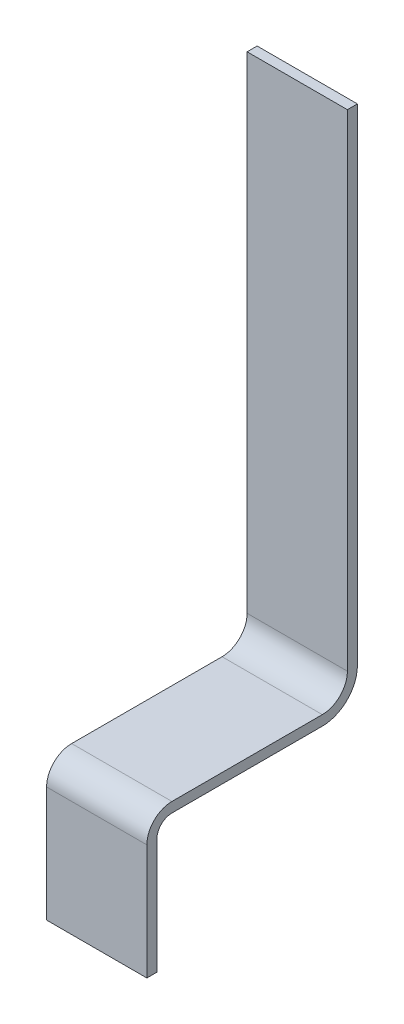
ISO-10303-21;
HEADER;
FILE_DESCRIPTION(('STEP AP214'),'2;1');
FILE_NAME('part.step','',(''),(''),'','','');
FILE_SCHEMA(('AUTOMOTIVE_DESIGN { 1 0 10303 214 1 1 1 1 }'));
ENDSEC;
DATA;
#1=APPLICATION_CONTEXT('core data for automotive mechanical design processes');
#2=APPLICATION_PROTOCOL_DEFINITION('international standard','automotive_design',2000,#1);
#3=PRODUCT_CONTEXT('',#1,'mechanical');
#4=PRODUCT('Part','Part','',(#3));
#5=PRODUCT_RELATED_PRODUCT_CATEGORY('part','',(#4));
#6=PRODUCT_DEFINITION_FORMATION('','',#4);
#7=PRODUCT_DEFINITION_CONTEXT('part definition',#1,'design');
#8=PRODUCT_DEFINITION('design','',#6,#7);
#9=PRODUCT_DEFINITION_SHAPE('','',#8);
#10=(LENGTH_UNIT() NAMED_UNIT(*) SI_UNIT(.MILLI.,.METRE.));
#11=(NAMED_UNIT(*) PLANE_ANGLE_UNIT() SI_UNIT($,.RADIAN.));
#12=(NAMED_UNIT(*) SI_UNIT($,.STERADIAN.) SOLID_ANGLE_UNIT());
#13=UNCERTAINTY_MEASURE_WITH_UNIT(LENGTH_MEASURE(1.E-05),#10,'distance_accuracy_value','');
#14=(GEOMETRIC_REPRESENTATION_CONTEXT(3) GLOBAL_UNCERTAINTY_ASSIGNED_CONTEXT((#13)) GLOBAL_UNIT_ASSIGNED_CONTEXT((#10,
#11,#12)) REPRESENTATION_CONTEXT('',''));
#15=CARTESIAN_POINT('',(0.,0.,0.));
#16=DIRECTION('',(0.,0.,1.));
#17=DIRECTION('',(1.,0.,0.));
#18=AXIS2_PLACEMENT_3D('',#15,#16,#17);
#19=CARTESIAN_POINT('',(-10.7,-19.2,-0.2));
#20=DIRECTION('',(0.,-1.,0.));
#21=DIRECTION('',(0.,0.,-1.));
#22=AXIS2_PLACEMENT_3D('',#19,#20,#21);
#23=PLANE('',#22);
#24=DIRECTION('',(0.,0.,-1.));
#25=VECTOR('',#24,1.);
#26=CARTESIAN_POINT('',(-10.7,-19.2,-0.2));
#27=LINE('',#26,#25);
#28=CARTESIAN_POINT('',(-10.7,-19.2,-0.2));
#29=VERTEX_POINT('',#28);
#30=CARTESIAN_POINT('',(-10.7,-19.2,0.));
#31=VERTEX_POINT('',#30);
#32=EDGE_CURVE('E209',#29,#31,#27,.F.);
#33=ORIENTED_EDGE('',*,*,#32,.T.);
#34=DIRECTION('',(1.,0.,0.));
#35=VECTOR('',#34,1.);
#36=CARTESIAN_POINT('',(-10.7,-19.2,0.));
#37=LINE('',#36,#35);
#38=CARTESIAN_POINT('',(-12.7,-19.2,0.));
#39=VERTEX_POINT('',#38);
#40=EDGE_CURVE('E193',#39,#31,#37,.T.);
#41=ORIENTED_EDGE('',*,*,#40,.F.);
#42=DIRECTION('',(0.,0.,-1.));
#43=VECTOR('',#42,1.);
#44=CARTESIAN_POINT('',(-12.7,-19.2,-0.2));
#45=LINE('',#44,#43);
#46=CARTESIAN_POINT('',(-12.7,-19.2,-0.2));
#47=VERTEX_POINT('',#46);
#48=EDGE_CURVE('E99',#39,#47,#45,.T.);
#49=ORIENTED_EDGE('',*,*,#48,.T.);
#50=DIRECTION('',(-1.,0.,0.));
#51=VECTOR('',#50,1.);
#52=CARTESIAN_POINT('',(-10.7,-19.2,-0.2));
#53=LINE('',#52,#51);
#54=EDGE_CURVE('E196',#29,#47,#53,.T.);
#55=ORIENTED_EDGE('',*,*,#54,.F.);
#56=EDGE_LOOP('',(#33,#41,#49,#55));
#57=FACE_BOUND('',#56,.T.);
#58=ADVANCED_FACE('F17',(#57),#23,.T.);
#59=CARTESIAN_POINT('',(-10.7,-16.9,-0.5));
#60=DIRECTION('',(-1.,0.,0.));
#61=DIRECTION('',(0.,0.,1.));
#62=AXIS2_PLACEMENT_3D('',#59,#60,#61);
#63=CYLINDRICAL_SURFACE('',#62,0.5);
#64=CARTESIAN_POINT('',(-10.7,-16.9,-0.5));
#65=DIRECTION('',(-1.,0.,0.));
#66=DIRECTION('',(0.,0.,1.));
#67=AXIS2_PLACEMENT_3D('',#64,#65,#66);
#68=CIRCLE('',#67,0.5);
#69=CARTESIAN_POINT('',(-10.7,-16.9,0.));
#70=VERTEX_POINT('',#69);
#71=CARTESIAN_POINT('',(-10.7,-16.4,-0.5));
#72=VERTEX_POINT('',#71);
#73=EDGE_CURVE('E222',#70,#72,#68,.T.);
#74=ORIENTED_EDGE('',*,*,#73,.T.);
#75=DIRECTION('',(1.,0.,0.));
#76=VECTOR('',#75,1.);
#77=CARTESIAN_POINT('',(-10.7,-16.4,-0.5));
#78=LINE('',#77,#76);
#79=CARTESIAN_POINT('',(-12.7,-16.4,-0.5));
#80=VERTEX_POINT('',#79);
#81=EDGE_CURVE('E186',#80,#72,#78,.T.);
#82=ORIENTED_EDGE('',*,*,#81,.F.);
#83=CARTESIAN_POINT('',(-12.7,-16.9,-0.5));
#84=DIRECTION('',(-1.,0.,0.));
#85=DIRECTION('',(0.,0.,1.));
#86=AXIS2_PLACEMENT_3D('',#83,#84,#85);
#87=CIRCLE('',#86,0.5);
#88=CARTESIAN_POINT('',(-12.7,-16.9,0.));
#89=VERTEX_POINT('',#88);
#90=EDGE_CURVE('E20',#80,#89,#87,.F.);
#91=ORIENTED_EDGE('',*,*,#90,.T.);
#92=DIRECTION('',(1.,0.,0.));
#93=VECTOR('',#92,1.);
#94=CARTESIAN_POINT('',(-10.7,-16.9,0.));
#95=LINE('',#94,#93);
#96=EDGE_CURVE('E189',#70,#89,#95,.F.);
#97=ORIENTED_EDGE('',*,*,#96,.F.);
#98=EDGE_LOOP('',(#74,#82,#91,#97));
#99=FACE_BOUND('',#98,.T.);
#100=ADVANCED_FACE('F223',(#99),#63,.T.);
#101=CARTESIAN_POINT('',(-10.7,-15.9,-3.5));
#102=DIRECTION('',(-1.,0.,0.));
#103=DIRECTION('',(0.,0.,1.));
#104=AXIS2_PLACEMENT_3D('',#101,#102,#103);
#105=CYLINDRICAL_SURFACE('',#104,0.5);
#106=DIRECTION('',(1.,0.,0.));
#107=VECTOR('',#106,1.);
#108=CARTESIAN_POINT('',(-10.7,-16.4,-3.5));
#109=LINE('',#108,#107);
#110=CARTESIAN_POINT('',(-10.7,-16.4,-3.5));
#111=VERTEX_POINT('',#110);
#112=CARTESIAN_POINT('',(-12.7,-16.4,-3.5));
#113=VERTEX_POINT('',#112);
#114=EDGE_CURVE('E185',#111,#113,#109,.F.);
#115=ORIENTED_EDGE('',*,*,#114,.F.);
#116=CARTESIAN_POINT('',(-10.7,-15.9,-3.5));
#117=DIRECTION('',(-1.,0.,0.));
#118=DIRECTION('',(0.,0.,1.));
#119=AXIS2_PLACEMENT_3D('',#116,#117,#118);
#120=CIRCLE('',#119,0.5);
#121=CARTESIAN_POINT('',(-10.7,-15.9,-4.));
#122=VERTEX_POINT('',#121);
#123=EDGE_CURVE('E221',#122,#111,#120,.T.);
#124=ORIENTED_EDGE('',*,*,#123,.F.);
#125=DIRECTION('',(1.,0.,0.));
#126=VECTOR('',#125,1.);
#127=CARTESIAN_POINT('',(-10.7,-15.9,-4.));
#128=LINE('',#127,#126);
#129=CARTESIAN_POINT('',(-12.7,-15.9,-4.));
#130=VERTEX_POINT('',#129);
#131=EDGE_CURVE('E125',#130,#122,#128,.T.);
#132=ORIENTED_EDGE('',*,*,#131,.F.);
#133=CARTESIAN_POINT('',(-12.7,-15.9,-3.5));
#134=DIRECTION('',(-1.,0.,0.));
#135=DIRECTION('',(0.,0.,1.));
#136=AXIS2_PLACEMENT_3D('',#133,#134,#135);
#137=CIRCLE('',#136,0.5);
#138=EDGE_CURVE('E219',#113,#130,#137,.F.);
#139=ORIENTED_EDGE('',*,*,#138,.F.);
#140=EDGE_LOOP('',(#115,#124,#132,#139));
#141=FACE_BOUND('',#140,.T.);
#142=ADVANCED_FACE('F359',(#141),#105,.F.);
#143=CARTESIAN_POINT('',(-10.7,-16.9,-0.5));
#144=DIRECTION('',(-1.,0.,0.));
#145=DIRECTION('',(0.,0.,1.));
#146=AXIS2_PLACEMENT_3D('',#143,#144,#145);
#147=CYLINDRICAL_SURFACE('',#146,0.3);
#148=DIRECTION('',(1.,0.,0.));
#149=VECTOR('',#148,1.);
#150=CARTESIAN_POINT('',(-10.7,-16.6,-0.5));
#151=LINE('',#150,#149);
#152=CARTESIAN_POINT('',(-10.7,-16.6,-0.5));
#153=VERTEX_POINT('',#152);
#154=CARTESIAN_POINT('',(-12.7,-16.6,-0.5));
#155=VERTEX_POINT('',#154);
#156=EDGE_CURVE('E179',#153,#155,#151,.F.);
#157=ORIENTED_EDGE('',*,*,#156,.F.);
#158=CARTESIAN_POINT('',(-10.7,-16.9,-0.5));
#159=DIRECTION('',(-1.,0.,0.));
#160=DIRECTION('',(0.,0.,1.));
#161=AXIS2_PLACEMENT_3D('',#158,#159,#160);
#162=CIRCLE('',#161,0.3);
#163=CARTESIAN_POINT('',(-10.7,-16.9,-0.2));
#164=VERTEX_POINT('',#163);
#165=EDGE_CURVE('E217',#164,#153,#162,.T.);
#166=ORIENTED_EDGE('',*,*,#165,.F.);
#167=DIRECTION('',(-1.,0.,0.));
#168=VECTOR('',#167,1.);
#169=CARTESIAN_POINT('',(-10.7,-16.9,-0.2));
#170=LINE('',#169,#168);
#171=CARTESIAN_POINT('',(-12.7,-16.9,-0.2));
#172=VERTEX_POINT('',#171);
#173=EDGE_CURVE('E199',#172,#164,#170,.F.);
#174=ORIENTED_EDGE('',*,*,#173,.F.);
#175=CARTESIAN_POINT('',(-12.7,-16.9,-0.5));
#176=DIRECTION('',(-1.,0.,0.));
#177=DIRECTION('',(0.,0.,1.));
#178=AXIS2_PLACEMENT_3D('',#175,#176,#177);
#179=CIRCLE('',#178,0.3);
#180=EDGE_CURVE('E202',#155,#172,#179,.F.);
#181=ORIENTED_EDGE('',*,*,#180,.F.);
#182=EDGE_LOOP('',(#157,#166,#174,#181));
#183=FACE_BOUND('',#182,.T.);
#184=ADVANCED_FACE('F259',(#183),#147,.F.);
#185=CARTESIAN_POINT('',(-10.7,-19.2,-0.2));
#186=DIRECTION('',(0.,0.,-1.));
#187=DIRECTION('',(-1.,0.,0.));
#188=AXIS2_PLACEMENT_3D('',#185,#186,#187);
#189=PLANE('',#188);
#190=DIRECTION('',(0.,1.,0.));
#191=VECTOR('',#190,1.);
#192=CARTESIAN_POINT('',(-10.7,-15.9,-0.2));
#193=LINE('',#192,#191);
#194=EDGE_CURVE('E234',#164,#29,#193,.F.);
#195=ORIENTED_EDGE('',*,*,#194,.T.);
#196=ORIENTED_EDGE('',*,*,#54,.T.);
#197=DIRECTION('',(0.,1.,0.));
#198=VECTOR('',#197,1.);
#199=CARTESIAN_POINT('',(-12.7,-15.9,-0.2));
#200=LINE('',#199,#198);
#201=EDGE_CURVE('E170',#172,#47,#200,.F.);
#202=ORIENTED_EDGE('',*,*,#201,.F.);
#203=ORIENTED_EDGE('',*,*,#173,.T.);
#204=EDGE_LOOP('',(#195,#196,#202,#203));
#205=FACE_BOUND('',#204,.T.);
#206=ADVANCED_FACE('F262',(#205),#189,.T.);
#207=CARTESIAN_POINT('',(-10.7,-19.2,0.));
#208=DIRECTION('',(0.,0.,1.));
#209=DIRECTION('',(1.,0.,0.));
#210=AXIS2_PLACEMENT_3D('',#207,#208,#209);
#211=PLANE('',#210);
#212=DIRECTION('',(0.,1.,0.));
#213=VECTOR('',#212,1.);
#214=CARTESIAN_POINT('',(-10.7,-15.9,0.));
#215=LINE('',#214,#213);
#216=EDGE_CURVE('E232',#31,#70,#215,.T.);
#217=ORIENTED_EDGE('',*,*,#216,.T.);
#218=ORIENTED_EDGE('',*,*,#96,.T.);
#219=DIRECTION('',(0.,1.,0.));
#220=VECTOR('',#219,1.);
#221=CARTESIAN_POINT('',(-12.7,-15.9,0.));
#222=LINE('',#221,#220);
#223=EDGE_CURVE('E168',#39,#89,#222,.T.);
#224=ORIENTED_EDGE('',*,*,#223,.F.);
#225=ORIENTED_EDGE('',*,*,#40,.T.);
#226=EDGE_LOOP('',(#217,#218,#224,#225));
#227=FACE_BOUND('',#226,.T.);
#228=ADVANCED_FACE('F265',(#227),#211,.T.);
#229=CARTESIAN_POINT('',(-10.7,-16.4,0.));
#230=DIRECTION('',(0.,1.,0.));
#231=DIRECTION('',(0.,0.,1.));
#232=AXIS2_PLACEMENT_3D('',#229,#230,#231);
#233=PLANE('',#232);
#234=DIRECTION('',(0.,0.,1.));
#235=VECTOR('',#234,1.);
#236=CARTESIAN_POINT('',(-10.7,-16.4,-3.5));
#237=LINE('',#236,#235);
#238=EDGE_CURVE('E128',#72,#111,#237,.F.);
#239=ORIENTED_EDGE('',*,*,#238,.T.);
#240=ORIENTED_EDGE('',*,*,#114,.T.);
#241=DIRECTION('',(0.,0.,1.));
#242=VECTOR('',#241,1.);
#243=CARTESIAN_POINT('',(-12.7,-16.4,-3.5));
#244=LINE('',#243,#242);
#245=EDGE_CURVE('E164',#80,#113,#244,.F.);
#246=ORIENTED_EDGE('',*,*,#245,.F.);
#247=ORIENTED_EDGE('',*,*,#81,.T.);
#248=EDGE_LOOP('',(#239,#240,#246,#247));
#249=FACE_BOUND('',#248,.T.);
#250=ADVANCED_FACE('F230',(#249),#233,.T.);
#251=CARTESIAN_POINT('',(-10.7,-16.4,-4.));
#252=DIRECTION('',(0.,0.,1.));
#253=DIRECTION('',(1.,0.,0.));
#254=AXIS2_PLACEMENT_3D('',#251,#252,#253);
#255=PLANE('',#254);
#256=DIRECTION('',(0.,1.,0.));
#257=VECTOR('',#256,1.);
#258=CARTESIAN_POINT('',(-10.7,-15.9,-4.));
#259=LINE('',#258,#257);
#260=CARTESIAN_POINT('',(-10.7,-6.2,-4.));
#261=VERTEX_POINT('',#260);
#262=EDGE_CURVE('E118',#122,#261,#259,.T.);
#263=ORIENTED_EDGE('',*,*,#262,.T.);
#264=DIRECTION('',(1.,0.,0.));
#265=VECTOR('',#264,1.);
#266=CARTESIAN_POINT('',(-10.7,-6.2,-4.));
#267=LINE('',#266,#265);
#268=CARTESIAN_POINT('',(-12.7,-6.2,-4.));
#269=VERTEX_POINT('',#268);
#270=EDGE_CURVE('E122',#269,#261,#267,.T.);
#271=ORIENTED_EDGE('',*,*,#270,.F.);
#272=DIRECTION('',(0.,1.,0.));
#273=VECTOR('',#272,1.);
#274=CARTESIAN_POINT('',(-12.7,-15.9,-4.));
#275=LINE('',#274,#273);
#276=EDGE_CURVE('E155',#130,#269,#275,.T.);
#277=ORIENTED_EDGE('',*,*,#276,.F.);
#278=ORIENTED_EDGE('',*,*,#131,.T.);
#279=EDGE_LOOP('',(#263,#271,#277,#278));
#280=FACE_BOUND('',#279,.T.);
#281=ADVANCED_FACE('F120',(#280),#255,.T.);
#282=CARTESIAN_POINT('',(-10.7,-16.6,0.));
#283=DIRECTION('',(0.,-1.,0.));
#284=DIRECTION('',(0.,0.,-1.));
#285=AXIS2_PLACEMENT_3D('',#282,#283,#284);
#286=PLANE('',#285);
#287=DIRECTION('',(0.,0.,1.));
#288=VECTOR('',#287,1.);
#289=CARTESIAN_POINT('',(-10.7,-16.6,-3.5));
#290=LINE('',#289,#288);
#291=CARTESIAN_POINT('',(-10.7,-16.6,-3.5));
#292=VERTEX_POINT('',#291);
#293=EDGE_CURVE('E134',#292,#153,#290,.T.);
#294=ORIENTED_EDGE('',*,*,#293,.T.);
#295=ORIENTED_EDGE('',*,*,#156,.T.);
#296=DIRECTION('',(0.,0.,1.));
#297=VECTOR('',#296,1.);
#298=CARTESIAN_POINT('',(-12.7,-16.6,-3.5));
#299=LINE('',#298,#297);
#300=CARTESIAN_POINT('',(-12.7,-16.6,-3.5));
#301=VERTEX_POINT('',#300);
#302=EDGE_CURVE('E174',#301,#155,#299,.T.);
#303=ORIENTED_EDGE('',*,*,#302,.F.);
#304=DIRECTION('',(-1.,0.,0.));
#305=VECTOR('',#304,1.);
#306=CARTESIAN_POINT('',(-10.7,-16.6,-3.5));
#307=LINE('',#306,#305);
#308=EDGE_CURVE('E160',#292,#301,#307,.T.);
#309=ORIENTED_EDGE('',*,*,#308,.F.);
#310=EDGE_LOOP('',(#294,#295,#303,#309));
#311=FACE_BOUND('',#310,.T.);
#312=ADVANCED_FACE('F254',(#311),#286,.T.);
#313=CARTESIAN_POINT('',(-12.7,-15.9,-3.5));
#314=DIRECTION('',(-1.,0.,0.));
#315=DIRECTION('',(0.,0.,1.));
#316=AXIS2_PLACEMENT_3D('',#313,#314,#315);
#317=PLANE('',#316);
#318=ORIENTED_EDGE('',*,*,#138,.T.);
#319=ORIENTED_EDGE('',*,*,#276,.T.);
#320=DIRECTION('',(0.,0.,1.));
#321=VECTOR('',#320,1.);
#322=CARTESIAN_POINT('',(-12.7,-6.2,-4.));
#323=LINE('',#322,#321);
#324=CARTESIAN_POINT('',(-12.7,-6.2,-4.2));
#325=VERTEX_POINT('',#324);
#326=EDGE_CURVE('E133',#325,#269,#323,.T.);
#327=ORIENTED_EDGE('',*,*,#326,.F.);
#328=DIRECTION('',(0.,1.,0.));
#329=VECTOR('',#328,1.);
#330=CARTESIAN_POINT('',(-12.7,-16.4,-4.2));
#331=LINE('',#330,#329);
#332=CARTESIAN_POINT('',(-12.7,-15.9,-4.2));
#333=VERTEX_POINT('',#332);
#334=EDGE_CURVE('E151',#333,#325,#331,.T.);
#335=ORIENTED_EDGE('',*,*,#334,.F.);
#336=CARTESIAN_POINT('',(-12.7,-15.9,-3.5));
#337=DIRECTION('',(-1.,0.,0.));
#338=DIRECTION('',(0.,0.,1.));
#339=AXIS2_PLACEMENT_3D('',#336,#337,#338);
#340=CIRCLE('',#339,0.7);
#341=EDGE_CURVE('E139',#301,#333,#340,.F.);
#342=ORIENTED_EDGE('',*,*,#341,.F.);
#343=ORIENTED_EDGE('',*,*,#302,.T.);
#344=ORIENTED_EDGE('',*,*,#180,.T.);
#345=ORIENTED_EDGE('',*,*,#201,.T.);
#346=ORIENTED_EDGE('',*,*,#48,.F.);
#347=ORIENTED_EDGE('',*,*,#223,.T.);
#348=ORIENTED_EDGE('',*,*,#90,.F.);
#349=ORIENTED_EDGE('',*,*,#245,.T.);
#350=EDGE_LOOP('',(#318,#319,#327,#335,#342,#343,#344,#345,#346,#347,#348,#349));
#351=FACE_BOUND('',#350,.T.);
#352=ADVANCED_FACE('F249',(#351),#317,.T.);
#353=CARTESIAN_POINT('',(-10.7,-6.2,-4.));
#354=DIRECTION('',(0.,1.,0.));
#355=DIRECTION('',(0.,0.,1.));
#356=AXIS2_PLACEMENT_3D('',#353,#354,#355);
#357=PLANE('',#356);
#358=DIRECTION('',(0.,0.,1.));
#359=VECTOR('',#358,1.);
#360=CARTESIAN_POINT('',(-10.7,-6.2,-3.5));
#361=LINE('',#360,#359);
#362=CARTESIAN_POINT('',(-10.7,-6.2,-4.2));
#363=VERTEX_POINT('',#362);
#364=EDGE_CURVE('E127',#261,#363,#361,.F.);
#365=ORIENTED_EDGE('',*,*,#364,.T.);
#366=DIRECTION('',(-1.,0.,0.));
#367=VECTOR('',#366,1.);
#368=CARTESIAN_POINT('',(-10.7,-6.2,-4.2));
#369=LINE('',#368,#367);
#370=EDGE_CURVE('E149',#325,#363,#369,.F.);
#371=ORIENTED_EDGE('',*,*,#370,.F.);
#372=ORIENTED_EDGE('',*,*,#326,.T.);
#373=ORIENTED_EDGE('',*,*,#270,.T.);
#374=EDGE_LOOP('',(#365,#371,#372,#373));
#375=FACE_BOUND('',#374,.T.);
#376=ADVANCED_FACE('F131',(#375),#357,.T.);
#377=CARTESIAN_POINT('',(-10.7,-15.9,-3.5));
#378=DIRECTION('',(-1.,0.,0.));
#379=DIRECTION('',(0.,0.,1.));
#380=AXIS2_PLACEMENT_3D('',#377,#378,#379);
#381=PLANE('',#380);
#382=ORIENTED_EDGE('',*,*,#262,.F.);
#383=ORIENTED_EDGE('',*,*,#123,.T.);
#384=ORIENTED_EDGE('',*,*,#238,.F.);
#385=ORIENTED_EDGE('',*,*,#73,.F.);
#386=ORIENTED_EDGE('',*,*,#216,.F.);
#387=ORIENTED_EDGE('',*,*,#32,.F.);
#388=ORIENTED_EDGE('',*,*,#194,.F.);
#389=ORIENTED_EDGE('',*,*,#165,.T.);
#390=ORIENTED_EDGE('',*,*,#293,.F.);
#391=CARTESIAN_POINT('',(-10.7,-15.9,-3.5));
#392=DIRECTION('',(-1.,0.,0.));
#393=DIRECTION('',(0.,0.,1.));
#394=AXIS2_PLACEMENT_3D('',#391,#392,#393);
#395=CIRCLE('',#394,0.7);
#396=CARTESIAN_POINT('',(-10.7,-15.9,-4.2));
#397=VERTEX_POINT('',#396);
#398=EDGE_CURVE('E35',#397,#292,#395,.T.);
#399=ORIENTED_EDGE('',*,*,#398,.F.);
#400=DIRECTION('',(0.,1.,0.));
#401=VECTOR('',#400,1.);
#402=CARTESIAN_POINT('',(-10.7,-16.4,-4.2));
#403=LINE('',#402,#401);
#404=EDGE_CURVE('E26',#363,#397,#403,.F.);
#405=ORIENTED_EDGE('',*,*,#404,.F.);
#406=ORIENTED_EDGE('',*,*,#364,.F.);
#407=EDGE_LOOP('',(#382,#383,#384,#385,#386,#387,#388,#389,#390,#399,#405,#406));
#408=FACE_BOUND('',#407,.T.);
#409=ADVANCED_FACE('F136',(#408),#381,.F.);
#410=CARTESIAN_POINT('',(-10.7,-15.9,-3.5));
#411=DIRECTION('',(-1.,0.,0.));
#412=DIRECTION('',(0.,0.,1.));
#413=AXIS2_PLACEMENT_3D('',#410,#411,#412);
#414=CYLINDRICAL_SURFACE('',#413,0.7);
#415=ORIENTED_EDGE('',*,*,#398,.T.);
#416=ORIENTED_EDGE('',*,*,#308,.T.);
#417=ORIENTED_EDGE('',*,*,#341,.T.);
#418=DIRECTION('',(-1.,0.,0.));
#419=VECTOR('',#418,1.);
#420=CARTESIAN_POINT('',(-10.7,-15.9,-4.2));
#421=LINE('',#420,#419);
#422=EDGE_CURVE('E11',#397,#333,#421,.T.);
#423=ORIENTED_EDGE('',*,*,#422,.F.);
#424=EDGE_LOOP('',(#415,#416,#417,#423));
#425=FACE_BOUND('',#424,.T.);
#426=ADVANCED_FACE('F251',(#425),#414,.T.);
#427=CARTESIAN_POINT('',(-10.7,-16.4,-4.2));
#428=DIRECTION('',(0.,0.,-1.));
#429=DIRECTION('',(-1.,0.,0.));
#430=AXIS2_PLACEMENT_3D('',#427,#428,#429);
#431=PLANE('',#430);
#432=ORIENTED_EDGE('',*,*,#404,.T.);
#433=ORIENTED_EDGE('',*,*,#422,.T.);
#434=ORIENTED_EDGE('',*,*,#334,.T.);
#435=ORIENTED_EDGE('',*,*,#370,.T.);
#436=EDGE_LOOP('',(#432,#433,#434,#435));
#437=FACE_BOUND('',#436,.T.);
#438=ADVANCED_FACE('F247',(#437),#431,.T.);
#439=CLOSED_SHELL('',(#58,#100,#142,#184,#206,#228,#250,#281,#312,#352,#376,#409,#426,#438));
#440=MANIFOLD_SOLID_BREP('B1',#439);
#441=ADVANCED_BREP_SHAPE_REPRESENTATION('',(#18,#440),#14);
#442=SHAPE_DEFINITION_REPRESENTATION(#9,#441);
ENDSEC;
END-ISO-10303-21;
